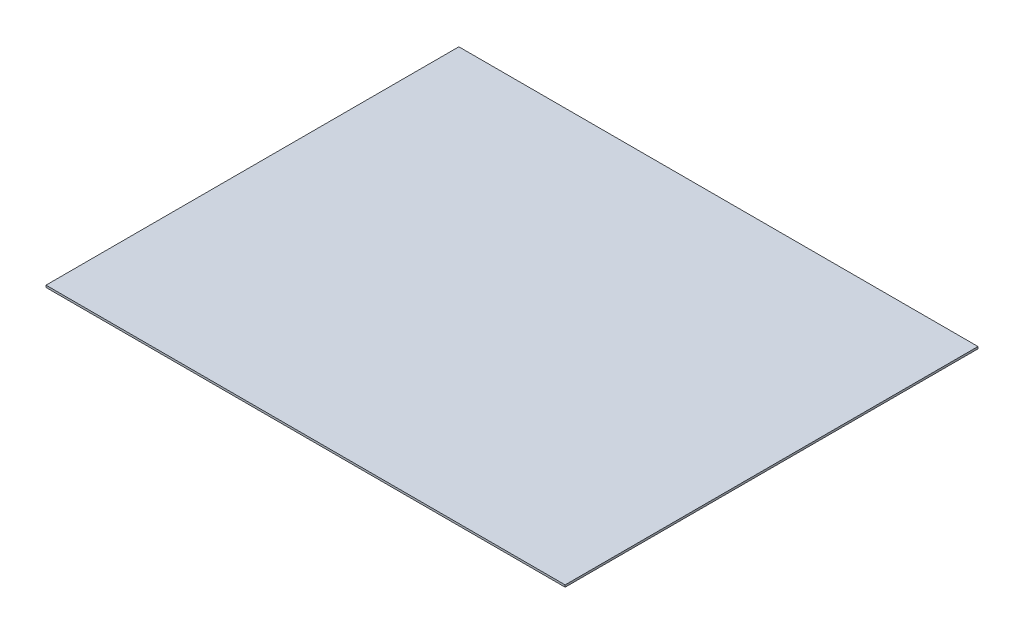
ISO-10303-21;
HEADER;
FILE_DESCRIPTION(('STEP AP214'),'2;1');
FILE_NAME('part.step','',(''),(''),'','','');
FILE_SCHEMA(('AUTOMOTIVE_DESIGN { 1 0 10303 214 1 1 1 1 }'));
ENDSEC;
DATA;
#1=APPLICATION_CONTEXT('core data for automotive mechanical design processes');
#2=APPLICATION_PROTOCOL_DEFINITION('international standard','automotive_design',2000,#1);
#3=PRODUCT_CONTEXT('',#1,'mechanical');
#4=PRODUCT('Part','Part','',(#3));
#5=PRODUCT_RELATED_PRODUCT_CATEGORY('part','',(#4));
#6=PRODUCT_DEFINITION_FORMATION('','',#4);
#7=PRODUCT_DEFINITION_CONTEXT('part definition',#1,'design');
#8=PRODUCT_DEFINITION('design','',#6,#7);
#9=PRODUCT_DEFINITION_SHAPE('','',#8);
#10=(LENGTH_UNIT() NAMED_UNIT(*) SI_UNIT(.MILLI.,.METRE.));
#11=(NAMED_UNIT(*) PLANE_ANGLE_UNIT() SI_UNIT($,.RADIAN.));
#12=(NAMED_UNIT(*) SI_UNIT($,.STERADIAN.) SOLID_ANGLE_UNIT());
#13=UNCERTAINTY_MEASURE_WITH_UNIT(LENGTH_MEASURE(1.E-05),#10,'distance_accuracy_value','');
#14=(GEOMETRIC_REPRESENTATION_CONTEXT(3) GLOBAL_UNCERTAINTY_ASSIGNED_CONTEXT((#13)) GLOBAL_UNIT_ASSIGNED_CONTEXT((#10,
#11,#12)) REPRESENTATION_CONTEXT('',''));
#15=CARTESIAN_POINT('',(0.,0.,0.));
#16=DIRECTION('',(0.,0.,1.));
#17=DIRECTION('',(1.,0.,0.));
#18=AXIS2_PLACEMENT_3D('',#15,#16,#17);
#19=CARTESIAN_POINT('',(-1.11022302462516E-13,2.54,-513.08));
#20=DIRECTION('',(0.,0.,-1.));
#21=DIRECTION('',(-1.,0.,0.));
#22=AXIS2_PLACEMENT_3D('',#19,#20,#21);
#23=PLANE('',#22);
#24=DIRECTION('',(1.,0.,0.));
#25=VECTOR('',#24,1.);
#26=CARTESIAN_POINT('',(-1.11022302462516E-13,0.,-513.08));
#27=LINE('',#26,#25);
#28=CARTESIAN_POINT('',(-1.11022302462516E-13,0.,-513.08));
#29=VERTEX_POINT('',#28);
#30=CARTESIAN_POINT('',(645.16,0.,-513.08));
#31=VERTEX_POINT('',#30);
#32=EDGE_CURVE('E96',#29,#31,#27,.T.);
#33=ORIENTED_EDGE('',*,*,#32,.F.);
#34=DIRECTION('',(0.,-1.,0.));
#35=VECTOR('',#34,1.);
#36=CARTESIAN_POINT('',(-1.11022302462516E-13,2.54,-513.08));
#37=LINE('',#36,#35);
#38=CARTESIAN_POINT('',(-1.11022302462516E-13,2.54,-513.08));
#39=VERTEX_POINT('',#38);
#40=EDGE_CURVE('E11',#39,#29,#37,.T.);
#41=ORIENTED_EDGE('',*,*,#40,.F.);
#42=DIRECTION('',(1.,0.,0.));
#43=VECTOR('',#42,1.);
#44=CARTESIAN_POINT('',(-1.11022302462516E-13,2.54,-513.08));
#45=LINE('',#44,#43);
#46=CARTESIAN_POINT('',(645.16,2.54,-513.08));
#47=VERTEX_POINT('',#46);
#48=EDGE_CURVE('E90',#39,#47,#45,.T.);
#49=ORIENTED_EDGE('',*,*,#48,.T.);
#50=DIRECTION('',(0.,-1.,0.));
#51=VECTOR('',#50,1.);
#52=CARTESIAN_POINT('',(645.16,2.54,-513.08));
#53=LINE('',#52,#51);
#54=EDGE_CURVE('E35',#47,#31,#53,.T.);
#55=ORIENTED_EDGE('',*,*,#54,.T.);
#56=EDGE_LOOP('',(#33,#41,#49,#55));
#57=FACE_BOUND('',#56,.T.);
#58=ADVANCED_FACE('F32',(#57),#23,.T.);
#59=CARTESIAN_POINT('',(0.,2.54,0.));
#60=DIRECTION('',(-1.,0.,0.));
#61=DIRECTION('',(0.,0.,1.));
#62=AXIS2_PLACEMENT_3D('',#59,#60,#61);
#63=PLANE('',#62);
#64=DIRECTION('',(0.,0.,-1.));
#65=VECTOR('',#64,1.);
#66=CARTESIAN_POINT('',(0.,0.,0.));
#67=LINE('',#66,#65);
#68=CARTESIAN_POINT('',(0.,0.,0.));
#69=VERTEX_POINT('',#68);
#70=EDGE_CURVE('E92',#69,#29,#67,.T.);
#71=ORIENTED_EDGE('',*,*,#70,.F.);
#72=DIRECTION('',(0.,-1.,0.));
#73=VECTOR('',#72,1.);
#74=CARTESIAN_POINT('',(0.,2.54,0.));
#75=LINE('',#74,#73);
#76=CARTESIAN_POINT('',(0.,2.54,0.));
#77=VERTEX_POINT('',#76);
#78=EDGE_CURVE('E41',#77,#69,#75,.T.);
#79=ORIENTED_EDGE('',*,*,#78,.F.);
#80=DIRECTION('',(0.,0.,-1.));
#81=VECTOR('',#80,1.);
#82=CARTESIAN_POINT('',(0.,2.54,0.));
#83=LINE('',#82,#81);
#84=EDGE_CURVE('E80',#77,#39,#83,.T.);
#85=ORIENTED_EDGE('',*,*,#84,.T.);
#86=ORIENTED_EDGE('',*,*,#40,.T.);
#87=EDGE_LOOP('',(#71,#79,#85,#86));
#88=FACE_BOUND('',#87,.T.);
#89=ADVANCED_FACE('F106',(#88),#63,.T.);
#90=CARTESIAN_POINT('',(0.,2.54,0.));
#91=DIRECTION('',(0.,0.,-1.));
#92=DIRECTION('',(-1.,0.,0.));
#93=AXIS2_PLACEMENT_3D('',#90,#91,#92);
#94=PLANE('',#93);
#95=DIRECTION('',(1.,0.,0.));
#96=VECTOR('',#95,1.);
#97=CARTESIAN_POINT('',(0.,0.,0.));
#98=LINE('',#97,#96);
#99=CARTESIAN_POINT('',(645.16,0.,0.));
#100=VERTEX_POINT('',#99);
#101=EDGE_CURVE('E85',#69,#100,#98,.T.);
#102=ORIENTED_EDGE('',*,*,#101,.T.);
#103=DIRECTION('',(0.,-1.,0.));
#104=VECTOR('',#103,1.);
#105=CARTESIAN_POINT('',(645.16,2.54,0.));
#106=LINE('',#105,#104);
#107=CARTESIAN_POINT('',(645.16,2.54,0.));
#108=VERTEX_POINT('',#107);
#109=EDGE_CURVE('E83',#108,#100,#106,.T.);
#110=ORIENTED_EDGE('',*,*,#109,.F.);
#111=DIRECTION('',(1.,0.,0.));
#112=VECTOR('',#111,1.);
#113=CARTESIAN_POINT('',(0.,2.54,0.));
#114=LINE('',#113,#112);
#115=EDGE_CURVE('E77',#77,#108,#114,.T.);
#116=ORIENTED_EDGE('',*,*,#115,.F.);
#117=ORIENTED_EDGE('',*,*,#78,.T.);
#118=EDGE_LOOP('',(#102,#110,#116,#117));
#119=FACE_BOUND('',#118,.T.);
#120=ADVANCED_FACE('F84',(#119),#94,.F.);
#121=CARTESIAN_POINT('',(645.16,2.54,0.));
#122=DIRECTION('',(-1.,0.,0.));
#123=DIRECTION('',(0.,0.,1.));
#124=AXIS2_PLACEMENT_3D('',#121,#122,#123);
#125=PLANE('',#124);
#126=DIRECTION('',(0.,0.,-1.));
#127=VECTOR('',#126,1.);
#128=CARTESIAN_POINT('',(645.16,0.,0.));
#129=LINE('',#128,#127);
#130=EDGE_CURVE('E99',#100,#31,#129,.T.);
#131=ORIENTED_EDGE('',*,*,#130,.T.);
#132=ORIENTED_EDGE('',*,*,#54,.F.);
#133=DIRECTION('',(0.,0.,-1.));
#134=VECTOR('',#133,1.);
#135=CARTESIAN_POINT('',(645.16,2.54,0.));
#136=LINE('',#135,#134);
#137=EDGE_CURVE('E74',#108,#47,#136,.T.);
#138=ORIENTED_EDGE('',*,*,#137,.F.);
#139=ORIENTED_EDGE('',*,*,#109,.T.);
#140=EDGE_LOOP('',(#131,#132,#138,#139));
#141=FACE_BOUND('',#140,.T.);
#142=ADVANCED_FACE('F89',(#141),#125,.F.);
#143=CARTESIAN_POINT('',(0.,2.54,0.));
#144=DIRECTION('',(0.,1.,0.));
#145=DIRECTION('',(0.,0.,1.));
#146=AXIS2_PLACEMENT_3D('',#143,#144,#145);
#147=PLANE('',#146);
#148=ORIENTED_EDGE('',*,*,#48,.F.);
#149=ORIENTED_EDGE('',*,*,#84,.F.);
#150=ORIENTED_EDGE('',*,*,#115,.T.);
#151=ORIENTED_EDGE('',*,*,#137,.T.);
#152=EDGE_LOOP('',(#148,#149,#150,#151));
#153=FACE_BOUND('',#152,.T.);
#154=ADVANCED_FACE('F79',(#153),#147,.T.);
#155=CARTESIAN_POINT('',(0.,0.,0.));
#156=DIRECTION('',(0.,1.,0.));
#157=DIRECTION('',(0.,0.,1.));
#158=AXIS2_PLACEMENT_3D('',#155,#156,#157);
#159=PLANE('',#158);
#160=ORIENTED_EDGE('',*,*,#32,.T.);
#161=ORIENTED_EDGE('',*,*,#130,.F.);
#162=ORIENTED_EDGE('',*,*,#101,.F.);
#163=ORIENTED_EDGE('',*,*,#70,.T.);
#164=EDGE_LOOP('',(#160,#161,#162,#163));
#165=FACE_BOUND('',#164,.T.);
#166=ADVANCED_FACE('F105',(#165),#159,.F.);
#167=CLOSED_SHELL('',(#58,#89,#120,#142,#154,#166));
#168=MANIFOLD_SOLID_BREP('B2',#167);
#169=ADVANCED_BREP_SHAPE_REPRESENTATION('',(#18,#168),#14);
#170=SHAPE_DEFINITION_REPRESENTATION(#9,#169);
ENDSEC;
END-ISO-10303-21;
